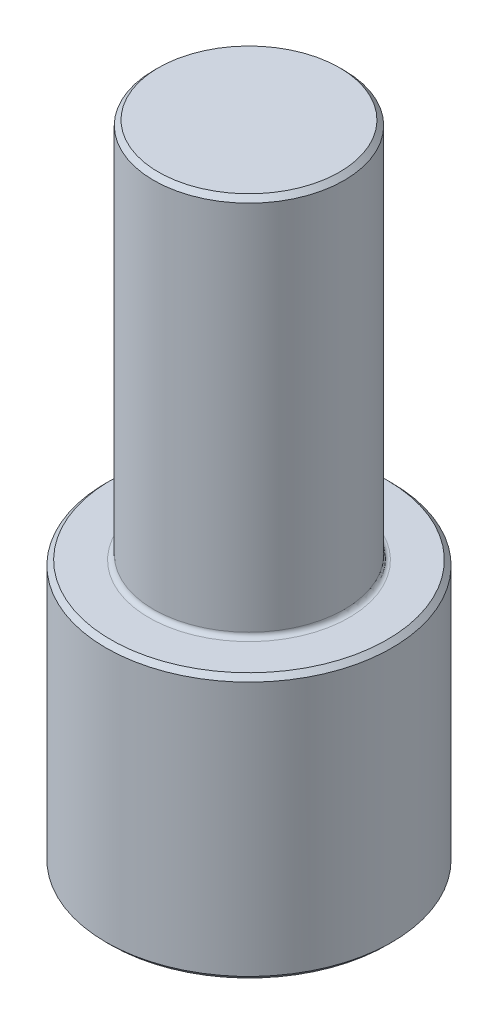
ISO-10303-21;
HEADER;
FILE_DESCRIPTION(('STEP AP214'),'2;1');
FILE_NAME('part.step','',(''),(''),'','','');
FILE_SCHEMA(('AUTOMOTIVE_DESIGN { 1 0 10303 214 1 1 1 1 }'));
ENDSEC;
DATA;
#1=APPLICATION_CONTEXT('core data for automotive mechanical design processes');
#2=APPLICATION_PROTOCOL_DEFINITION('international standard','automotive_design',2000,#1);
#3=PRODUCT_CONTEXT('',#1,'mechanical');
#4=PRODUCT('Part','Part','',(#3));
#5=PRODUCT_RELATED_PRODUCT_CATEGORY('part','',(#4));
#6=PRODUCT_DEFINITION_FORMATION('','',#4);
#7=PRODUCT_DEFINITION_CONTEXT('part definition',#1,'design');
#8=PRODUCT_DEFINITION('design','',#6,#7);
#9=PRODUCT_DEFINITION_SHAPE('','',#8);
#10=(LENGTH_UNIT() NAMED_UNIT(*) SI_UNIT(.MILLI.,.METRE.));
#11=(NAMED_UNIT(*) PLANE_ANGLE_UNIT() SI_UNIT($,.RADIAN.));
#12=(NAMED_UNIT(*) SI_UNIT($,.STERADIAN.) SOLID_ANGLE_UNIT());
#13=UNCERTAINTY_MEASURE_WITH_UNIT(LENGTH_MEASURE(1.E-05),#10,'distance_accuracy_value','');
#14=(GEOMETRIC_REPRESENTATION_CONTEXT(3) GLOBAL_UNCERTAINTY_ASSIGNED_CONTEXT((#13)) GLOBAL_UNIT_ASSIGNED_CONTEXT((#10,
#11,#12)) REPRESENTATION_CONTEXT('',''));
#15=CARTESIAN_POINT('',(0.,0.,0.));
#16=DIRECTION('',(0.,0.,1.));
#17=DIRECTION('',(1.,0.,0.));
#18=AXIS2_PLACEMENT_3D('',#15,#16,#17);
#19=CARTESIAN_POINT('',(0.,0.,0.));
#20=DIRECTION('',(0.,1.,0.));
#21=DIRECTION('',(0.,0.,1.));
#22=AXIS2_PLACEMENT_3D('',#19,#20,#21);
#23=PLANE('',#22);
#24=CARTESIAN_POINT('',(0.,0.,0.));
#25=DIRECTION('',(0.,1.,0.));
#26=DIRECTION('',(0.,0.,1.));
#27=AXIS2_PLACEMENT_3D('',#24,#25,#26);
#28=CIRCLE('',#27,5.8);
#29=CARTESIAN_POINT('',(0.,0.,5.8));
#30=VERTEX_POINT('',#29);
#31=EDGE_CURVE('E78',#30,#30,#28,.F.);
#32=ORIENTED_EDGE('',*,*,#31,.T.);
#33=EDGE_LOOP('',(#32));
#34=FACE_BOUND('',#33,.T.);
#35=CARTESIAN_POINT('',(0.,0.,0.));
#36=DIRECTION('',(0.,-1.,0.));
#37=DIRECTION('',(0.,0.,-1.));
#38=AXIS2_PLACEMENT_3D('',#35,#36,#37);
#39=CIRCLE('',#38,1.64999999999999);
#40=CARTESIAN_POINT('',(0.,0.,-1.64999999999999));
#41=VERTEX_POINT('',#40);
#42=EDGE_CURVE('E62',#41,#41,#39,.T.);
#43=ORIENTED_EDGE('',*,*,#42,.F.);
#44=EDGE_LOOP('',(#43));
#45=FACE_BOUND('',#44,.T.);
#46=ADVANCED_FACE('F41',(#34,#45),#23,.F.);
#47=CARTESIAN_POINT('',(0.,7.47619047619048,0.));
#48=DIRECTION('',(0.,1.,0.));
#49=DIRECTION('',(0.,0.,1.));
#50=AXIS2_PLACEMENT_3D('',#47,#48,#49);
#51=CYLINDRICAL_SURFACE('',#50,6.);
#52=CARTESIAN_POINT('',(0.,0.199999999999998,0.));
#53=DIRECTION('',(0.,1.,0.));
#54=DIRECTION('',(0.,0.,1.));
#55=AXIS2_PLACEMENT_3D('',#52,#53,#54);
#56=CIRCLE('',#55,6.);
#57=CARTESIAN_POINT('',(0.,0.199999999999998,6.));
#58=VERTEX_POINT('',#57);
#59=EDGE_CURVE('E75',#58,#58,#56,.T.);
#60=ORIENTED_EDGE('',*,*,#59,.T.);
#61=EDGE_LOOP('',(#60));
#62=FACE_BOUND('',#61,.T.);
#63=CARTESIAN_POINT('',(0.,10.9000000000003,0.));
#64=DIRECTION('',(0.,-1.,0.));
#65=DIRECTION('',(0.,0.,-1.));
#66=AXIS2_PLACEMENT_3D('',#63,#64,#65);
#67=CIRCLE('',#66,6.);
#68=CARTESIAN_POINT('',(0.,10.9000000000003,-6.));
#69=VERTEX_POINT('',#68);
#70=EDGE_CURVE('E72',#69,#69,#67,.T.);
#71=ORIENTED_EDGE('',*,*,#70,.T.);
#72=EDGE_LOOP('',(#71));
#73=FACE_BOUND('',#72,.T.);
#74=ADVANCED_FACE('F97',(#62,#73),#51,.T.);
#75=CARTESIAN_POINT('',(6.,11.1000000000003,0.));
#76=DIRECTION('',(0.,-1.,0.));
#77=DIRECTION('',(0.,0.,-1.));
#78=AXIS2_PLACEMENT_3D('',#75,#76,#77);
#79=PLANE('',#78);
#80=CARTESIAN_POINT('',(0.,11.1000000000003,0.));
#81=DIRECTION('',(0.,-1.,0.));
#82=DIRECTION('',(0.,0.,-1.));
#83=AXIS2_PLACEMENT_3D('',#80,#81,#82);
#84=CIRCLE('',#83,5.8);
#85=CARTESIAN_POINT('',(0.,11.1000000000003,-5.8));
#86=VERTEX_POINT('',#85);
#87=EDGE_CURVE('E81',#86,#86,#84,.F.);
#88=ORIENTED_EDGE('',*,*,#87,.T.);
#89=EDGE_LOOP('',(#88));
#90=FACE_BOUND('',#89,.T.);
#91=CARTESIAN_POINT('',(0.,11.1000000000003,0.));
#92=DIRECTION('',(0.,-1.,0.));
#93=DIRECTION('',(0.,0.,-1.));
#94=AXIS2_PLACEMENT_3D('',#91,#92,#93);
#95=CIRCLE('',#94,4.2);
#96=CARTESIAN_POINT('',(0.,11.1000000000003,-4.2));
#97=VERTEX_POINT('',#96);
#98=EDGE_CURVE('E65',#97,#97,#95,.T.);
#99=ORIENTED_EDGE('',*,*,#98,.T.);
#100=EDGE_LOOP('',(#99));
#101=FACE_BOUND('',#100,.T.);
#102=ADVANCED_FACE('F103',(#90,#101),#79,.F.);
#103=CARTESIAN_POINT('',(0.,7.47619047619048,0.));
#104=DIRECTION('',(0.,1.,0.));
#105=DIRECTION('',(0.,0.,1.));
#106=AXIS2_PLACEMENT_3D('',#103,#104,#105);
#107=CYLINDRICAL_SURFACE('',#106,4.);
#108=CARTESIAN_POINT('',(0.,26.9000000000003,0.));
#109=DIRECTION('',(0.,-1.,0.));
#110=DIRECTION('',(0.,0.,-1.));
#111=AXIS2_PLACEMENT_3D('',#108,#109,#110);
#112=CIRCLE('',#111,4.);
#113=CARTESIAN_POINT('',(0.,26.9000000000003,-4.));
#114=VERTEX_POINT('',#113);
#115=EDGE_CURVE('E11',#114,#114,#112,.T.);
#116=ORIENTED_EDGE('',*,*,#115,.T.);
#117=EDGE_LOOP('',(#116));
#118=FACE_BOUND('',#117,.T.);
#119=CARTESIAN_POINT('',(0.,11.3000000000003,0.));
#120=DIRECTION('',(0.,-1.,0.));
#121=DIRECTION('',(0.,0.,-1.));
#122=AXIS2_PLACEMENT_3D('',#119,#120,#121);
#123=CIRCLE('',#122,4.);
#124=CARTESIAN_POINT('',(0.,11.3000000000003,-4.));
#125=VERTEX_POINT('',#124);
#126=EDGE_CURVE('E61',#125,#125,#123,.F.);
#127=ORIENTED_EDGE('',*,*,#126,.T.);
#128=EDGE_LOOP('',(#127));
#129=FACE_BOUND('',#128,.T.);
#130=ADVANCED_FACE('F127',(#118,#129),#107,.T.);
#131=CARTESIAN_POINT('',(4.,27.1000000000003,0.));
#132=DIRECTION('',(0.,-1.,0.));
#133=DIRECTION('',(0.,0.,-1.));
#134=AXIS2_PLACEMENT_3D('',#131,#132,#133);
#135=PLANE('',#134);
#136=CARTESIAN_POINT('',(0.,27.1000000000003,0.));
#137=DIRECTION('',(0.,-1.,0.));
#138=DIRECTION('',(0.,0.,-1.));
#139=AXIS2_PLACEMENT_3D('',#136,#137,#138);
#140=CIRCLE('',#139,3.8);
#141=CARTESIAN_POINT('',(0.,27.1000000000003,-3.8));
#142=VERTEX_POINT('',#141);
#143=EDGE_CURVE('E48',#142,#142,#140,.F.);
#144=ORIENTED_EDGE('',*,*,#143,.T.);
#145=EDGE_LOOP('',(#144));
#146=FACE_BOUND('',#145,.T.);
#147=ADVANCED_FACE('F55',(#146),#135,.F.);
#148=CARTESIAN_POINT('',(0.,12.,0.));
#149=DIRECTION('',(0.,-1.,0.));
#150=DIRECTION('',(0.,0.,-1.));
#151=AXIS2_PLACEMENT_3D('',#148,#149,#150);
#152=CONICAL_SURFACE('',#151,1.64999999999999,1.02974425867665);
#153=CARTESIAN_POINT('',(0.,12.9914200213955,0.));
#154=VERTEX_POINT('',#153);
#155=VERTEX_LOOP('',#154);
#156=FACE_BOUND('',#155,.T.);
#157=CARTESIAN_POINT('',(0.,12.,0.));
#158=DIRECTION('',(0.,-1.,0.));
#159=DIRECTION('',(0.,0.,-1.));
#160=AXIS2_PLACEMENT_3D('',#157,#158,#159);
#161=CIRCLE('',#160,1.64999999999999);
#162=CARTESIAN_POINT('',(0.,12.,-1.64999999999999));
#163=VERTEX_POINT('',#162);
#164=EDGE_CURVE('E59',#163,#163,#161,.T.);
#165=ORIENTED_EDGE('',*,*,#164,.T.);
#166=EDGE_LOOP('',(#165));
#167=FACE_BOUND('',#166,.T.);
#168=ADVANCED_FACE('F51',(#156,#167),#152,.F.);
#169=CARTESIAN_POINT('',(0.,0.,0.));
#170=DIRECTION('',(0.,-1.,0.));
#171=DIRECTION('',(0.,0.,-1.));
#172=AXIS2_PLACEMENT_3D('',#169,#170,#171);
#173=CYLINDRICAL_SURFACE('',#172,1.64999999999999);
#174=ORIENTED_EDGE('',*,*,#164,.F.);
#175=EDGE_LOOP('',(#174));
#176=FACE_BOUND('',#175,.T.);
#177=ORIENTED_EDGE('',*,*,#42,.T.);
#178=EDGE_LOOP('',(#177));
#179=FACE_BOUND('',#178,.T.);
#180=ADVANCED_FACE('F54',(#176,#179),#173,.F.);
#181=CARTESIAN_POINT('',(0.,11.3000000000003,0.));
#182=DIRECTION('',(0.,-1.,0.));
#183=DIRECTION('',(0.,0.,-1.));
#184=AXIS2_PLACEMENT_3D('',#181,#182,#183);
#185=TOROIDAL_SURFACE('',#184,4.2,0.2);
#186=ORIENTED_EDGE('',*,*,#98,.F.);
#187=EDGE_LOOP('',(#186));
#188=FACE_BOUND('',#187,.T.);
#189=ORIENTED_EDGE('',*,*,#126,.F.);
#190=EDGE_LOOP('',(#189));
#191=FACE_BOUND('',#190,.T.);
#192=ADVANCED_FACE('F109',(#188,#191),#185,.F.);
#193=CARTESIAN_POINT('',(0.,0.199999999999998,0.));
#194=DIRECTION('',(0.,1.,0.));
#195=DIRECTION('',(0.,0.,1.));
#196=AXIS2_PLACEMENT_3D('',#193,#194,#195);
#197=CONICAL_SURFACE('',#196,6.,0.78539816339745);
#198=ORIENTED_EDGE('',*,*,#31,.F.);
#199=EDGE_LOOP('',(#198));
#200=FACE_BOUND('',#199,.T.);
#201=ORIENTED_EDGE('',*,*,#59,.F.);
#202=EDGE_LOOP('',(#201));
#203=FACE_BOUND('',#202,.T.);
#204=ADVANCED_FACE('F93',(#200,#203),#197,.T.);
#205=CARTESIAN_POINT('',(0.,11.1000000000003,0.));
#206=DIRECTION('',(0.,-1.,0.));
#207=DIRECTION('',(0.,0.,-1.));
#208=AXIS2_PLACEMENT_3D('',#205,#206,#207);
#209=CONICAL_SURFACE('',#208,5.8,0.785398163397453);
#210=CARTESIAN_POINT('',(0.,10.9000000000003,-6.));
#211=CARTESIAN_POINT('',(0.,10.9020833333336,-5.99791666666666));
#212=CARTESIAN_POINT('',(0.,10.904166666667,-5.99583333333333));
#213=CARTESIAN_POINT('',(0.,10.9083333333336,-5.99166666666666));
#214=CARTESIAN_POINT('',(0.,10.910416666667,-5.98958333333333));
#215=CARTESIAN_POINT('',(0.,10.9145833333336,-5.98541666666666));
#216=CARTESIAN_POINT('',(0.,10.916666666667,-5.98333333333333));
#217=CARTESIAN_POINT('',(0.,10.9208333333336,-5.97916666666667));
#218=CARTESIAN_POINT('',(0.,10.922916666667,-5.97708333333333));
#219=CARTESIAN_POINT('',(0.,10.9270833333336,-5.97291666666667));
#220=CARTESIAN_POINT('',(0.,10.929166666667,-5.97083333333333));
#221=CARTESIAN_POINT('',(0.,10.9333333333336,-5.96666666666667));
#222=CARTESIAN_POINT('',(0.,10.935416666667,-5.96458333333333));
#223=CARTESIAN_POINT('',(0.,10.9395833333336,-5.96041666666667));
#224=CARTESIAN_POINT('',(0.,10.941666666667,-5.95833333333333));
#225=CARTESIAN_POINT('',(0.,10.9458333333336,-5.95416666666667));
#226=CARTESIAN_POINT('',(0.,10.947916666667,-5.95208333333333));
#227=CARTESIAN_POINT('',(0.,10.9520833333336,-5.94791666666667));
#228=CARTESIAN_POINT('',(0.,10.954166666667,-5.94583333333333));
#229=CARTESIAN_POINT('',(0.,10.9583333333336,-5.94166666666667));
#230=CARTESIAN_POINT('',(0.,10.960416666667,-5.93958333333333));
#231=CARTESIAN_POINT('',(0.,10.9645833333336,-5.93541666666667));
#232=CARTESIAN_POINT('',(0.,10.966666666667,-5.93333333333333));
#233=CARTESIAN_POINT('',(0.,10.9708333333336,-5.92916666666667));
#234=CARTESIAN_POINT('',(0.,10.972916666667,-5.92708333333333));
#235=CARTESIAN_POINT('',(0.,10.9770833333336,-5.92291666666667));
#236=CARTESIAN_POINT('',(0.,10.979166666667,-5.92083333333333));
#237=CARTESIAN_POINT('',(0.,10.9833333333336,-5.91666666666667));
#238=CARTESIAN_POINT('',(0.,10.985416666667,-5.91458333333333));
#239=CARTESIAN_POINT('',(0.,10.9895833333336,-5.91041666666667));
#240=CARTESIAN_POINT('',(0.,10.991666666667,-5.90833333333333));
#241=CARTESIAN_POINT('',(0.,10.9958333333336,-5.90416666666667));
#242=CARTESIAN_POINT('',(0.,10.997916666667,-5.90208333333333));
#243=CARTESIAN_POINT('',(0.,11.0020833333336,-5.89791666666667));
#244=CARTESIAN_POINT('',(0.,11.004166666667,-5.89583333333333));
#245=CARTESIAN_POINT('',(0.,11.0083333333336,-5.89166666666667));
#246=CARTESIAN_POINT('',(0.,11.010416666667,-5.88958333333333));
#247=CARTESIAN_POINT('',(0.,11.0145833333336,-5.88541666666667));
#248=CARTESIAN_POINT('',(0.,11.016666666667,-5.88333333333333));
#249=CARTESIAN_POINT('',(0.,11.0208333333336,-5.87916666666667));
#250=CARTESIAN_POINT('',(0.,11.022916666667,-5.87708333333333));
#251=CARTESIAN_POINT('',(0.,11.0270833333336,-5.87291666666667));
#252=CARTESIAN_POINT('',(0.,11.029166666667,-5.87083333333333));
#253=CARTESIAN_POINT('',(0.,11.0333333333336,-5.86666666666667));
#254=CARTESIAN_POINT('',(0.,11.035416666667,-5.86458333333333));
#255=CARTESIAN_POINT('',(0.,11.0395833333336,-5.86041666666667));
#256=CARTESIAN_POINT('',(0.,11.041666666667,-5.85833333333333));
#257=CARTESIAN_POINT('',(0.,11.0458333333336,-5.85416666666667));
#258=CARTESIAN_POINT('',(0.,11.047916666667,-5.85208333333333));
#259=CARTESIAN_POINT('',(0.,11.0520833333336,-5.84791666666667));
#260=CARTESIAN_POINT('',(0.,11.054166666667,-5.84583333333333));
#261=CARTESIAN_POINT('',(0.,11.0583333333336,-5.84166666666667));
#262=CARTESIAN_POINT('',(0.,11.060416666667,-5.83958333333333));
#263=CARTESIAN_POINT('',(0.,11.0645833333336,-5.83541666666667));
#264=CARTESIAN_POINT('',(0.,11.066666666667,-5.83333333333333));
#265=CARTESIAN_POINT('',(0.,11.0708333333336,-5.82916666666667));
#266=CARTESIAN_POINT('',(0.,11.072916666667,-5.82708333333334));
#267=CARTESIAN_POINT('',(0.,11.0770833333336,-5.82291666666667));
#268=CARTESIAN_POINT('',(0.,11.079166666667,-5.82083333333334));
#269=CARTESIAN_POINT('',(0.,11.0833333333336,-5.81666666666667));
#270=CARTESIAN_POINT('',(0.,11.085416666667,-5.81458333333333));
#271=CARTESIAN_POINT('',(0.,11.0895833333336,-5.81041666666667));
#272=CARTESIAN_POINT('',(0.,11.091666666667,-5.80833333333334));
#273=CARTESIAN_POINT('',(0.,11.0958333333336,-5.80416666666667));
#274=CARTESIAN_POINT('',(0.,11.097916666667,-5.80208333333334));
#275=CARTESIAN_POINT('',(0.,11.1000000000003,-5.8));
#276=B_SPLINE_CURVE_WITH_KNOTS('',3,(#210,#211,#212,#213,#214,#215,#216,#217,#218,#219,#220,
#221,#222,#223,#224,#225,#226,#227,#228,#229,#230,#231,#232,#233,#234,#235,#236,#237,#238,#239,
#240,#241,#242,#243,#244,#245,#246,#247,#248,#249,#250,#251,#252,#253,#254,#255,#256,#257,#258,
#259,#260,#261,#262,#263,#264,#265,#266,#267,#268,#269,#270,#271,#272,#273,#274,#275),
.UNSPECIFIED.,.F.,.F.,(4,2,2,2,2,2,2,2,2,2,2,2,2,2,2,2,2,2,2,2,2,2,2,2,2,2,2,2,2,2,2,2,4),(0.,
0.00883883476483271,0.0176776695296636,0.0265165042944951,0.0353553390593272,0.0441941738241586,
0.0530330085889901,0.061871843353821,0.0707106781186537,0.0795495128834852,0.0883883476483161,
0.0972271824131488,0.10606601717798,0.114904851942811,0.123743686707643,0.132582521472475,
0.141421356237306,0.150260191002138,0.15909902576697,0.167937860531801,0.176776695296632,
0.185615530061464,0.194454364826296,0.203293199591127,0.212132034355959,0.220970869120791,
0.229809703885622,0.238648538650454,0.247487373415285,0.256326208180117,0.265165042944949,
0.27400387770978,0.282842712474611),.UNSPECIFIED.);
#277=EDGE_CURVE('BSEAM88',#69,#86,#276,.T.);
#278=ORIENTED_EDGE('',*,*,#70,.F.);
#279=ORIENTED_EDGE('',*,*,#87,.F.);
#280=ORIENTED_EDGE('',*,*,#277,.T.);
#281=ORIENTED_EDGE('',*,*,#277,.F.);
#282=EDGE_LOOP('',(#278,#280,#279,#281));
#283=FACE_BOUND('',#282,.T.);
#284=ADVANCED_FACE('F88',(#283),#209,.T.);
#285=CARTESIAN_POINT('',(0.,27.1000000000003,0.));
#286=DIRECTION('',(0.,-1.,0.));
#287=DIRECTION('',(0.,0.,-1.));
#288=AXIS2_PLACEMENT_3D('',#285,#286,#287);
#289=CONICAL_SURFACE('',#288,3.8,0.785398163397448);
#290=ORIENTED_EDGE('',*,*,#115,.F.);
#291=EDGE_LOOP('',(#290));
#292=FACE_BOUND('',#291,.T.);
#293=ORIENTED_EDGE('',*,*,#143,.F.);
#294=EDGE_LOOP('',(#293));
#295=FACE_BOUND('',#294,.T.);
#296=ADVANCED_FACE('F43',(#292,#295),#289,.T.);
#297=CLOSED_SHELL('',(#46,#74,#102,#130,#147,#168,#180,#192,#204,#284,#296));
#298=MANIFOLD_SOLID_BREP('B2',#297);
#299=ADVANCED_BREP_SHAPE_REPRESENTATION('',(#18,#298),#14);
#300=SHAPE_DEFINITION_REPRESENTATION(#9,#299);
ENDSEC;
END-ISO-10303-21;
